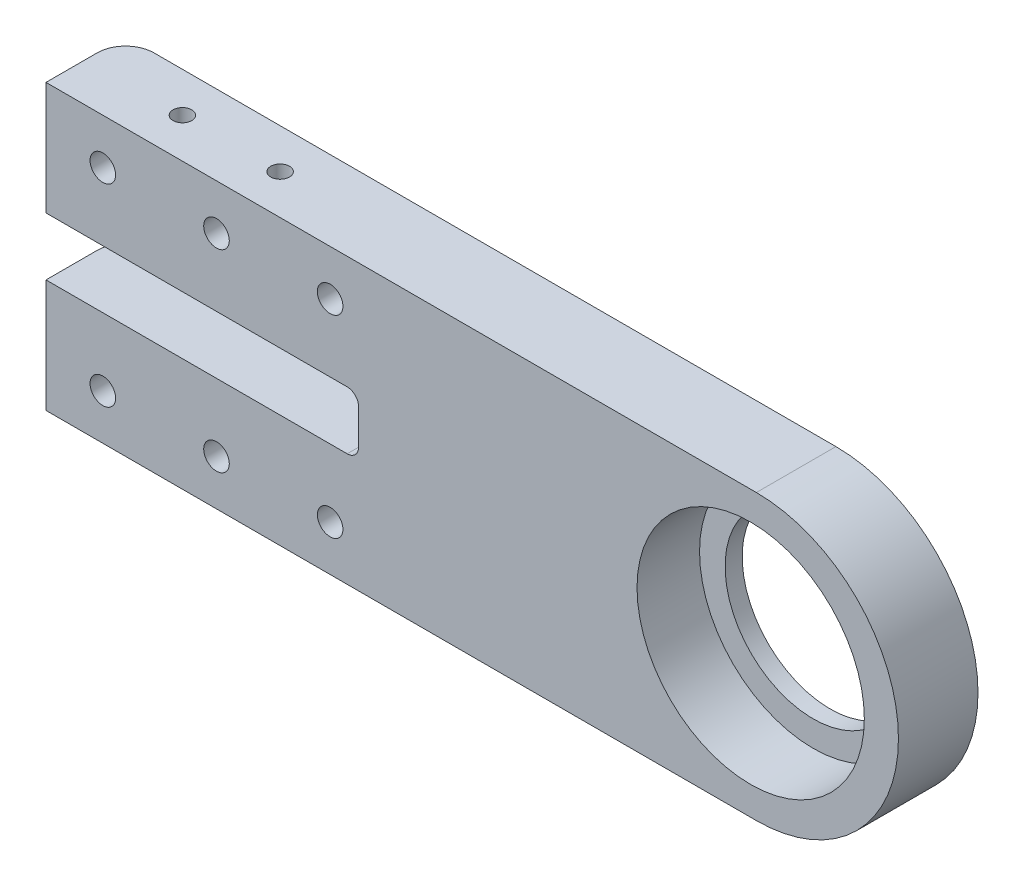
ISO-10303-21;
HEADER;
FILE_DESCRIPTION(('STEP AP214'),'2;1');
FILE_NAME('part.step','',(''),(''),'','','');
FILE_SCHEMA(('AUTOMOTIVE_DESIGN { 1 0 10303 214 1 1 1 1 }'));
ENDSEC;
DATA;
#1=APPLICATION_CONTEXT('core data for automotive mechanical design processes');
#2=APPLICATION_PROTOCOL_DEFINITION('international standard','automotive_design',2000,#1);
#3=PRODUCT_CONTEXT('',#1,'mechanical');
#4=PRODUCT('Part','Part','',(#3));
#5=PRODUCT_RELATED_PRODUCT_CATEGORY('part','',(#4));
#6=PRODUCT_DEFINITION_FORMATION('','',#4);
#7=PRODUCT_DEFINITION_CONTEXT('part definition',#1,'design');
#8=PRODUCT_DEFINITION('design','',#6,#7);
#9=PRODUCT_DEFINITION_SHAPE('','',#8);
#10=(LENGTH_UNIT() NAMED_UNIT(*) SI_UNIT(.MILLI.,.METRE.));
#11=(NAMED_UNIT(*) PLANE_ANGLE_UNIT() SI_UNIT($,.RADIAN.));
#12=(NAMED_UNIT(*) SI_UNIT($,.STERADIAN.) SOLID_ANGLE_UNIT());
#13=UNCERTAINTY_MEASURE_WITH_UNIT(LENGTH_MEASURE(1.E-05),#10,'distance_accuracy_value','');
#14=(GEOMETRIC_REPRESENTATION_CONTEXT(3) GLOBAL_UNCERTAINTY_ASSIGNED_CONTEXT((#13)) GLOBAL_UNIT_ASSIGNED_CONTEXT((#10,
#11,#12)) REPRESENTATION_CONTEXT('',''));
#15=CARTESIAN_POINT('',(0.,0.,0.));
#16=DIRECTION('',(0.,0.,1.));
#17=DIRECTION('',(1.,0.,0.));
#18=AXIS2_PLACEMENT_3D('',#15,#16,#17);
#19=CARTESIAN_POINT('',(0.,-50.,14.));
#20=DIRECTION('',(-1.,0.,0.));
#21=DIRECTION('',(0.,-1.,0.));
#22=AXIS2_PLACEMENT_3D('',#19,#20,#21);
#23=PLANE('',#22);
#24=DIRECTION('',(0.,0.,-1.));
#25=VECTOR('',#24,1.);
#26=CARTESIAN_POINT('',(0.,0.,14.));
#27=LINE('',#26,#25);
#28=CARTESIAN_POINT('',(0.,0.,14.));
#29=VERTEX_POINT('',#28);
#30=CARTESIAN_POINT('',(0.,0.,5.));
#31=VERTEX_POINT('',#30);
#32=EDGE_CURVE('E176',#29,#31,#27,.T.);
#33=ORIENTED_EDGE('',*,*,#32,.T.);
#34=DIRECTION('',(0.,1.,0.));
#35=VECTOR('',#34,1.);
#36=CARTESIAN_POINT('',(0.,-50.,5.));
#37=LINE('',#36,#35);
#38=CARTESIAN_POINT('',(0.,-19.8999999994651,5.));
#39=VERTEX_POINT('',#38);
#40=EDGE_CURVE('E49',#31,#39,#37,.F.);
#41=ORIENTED_EDGE('',*,*,#40,.T.);
#42=DIRECTION('',(0.,0.,1.));
#43=VECTOR('',#42,1.);
#44=CARTESIAN_POINT('',(0.,-19.8999999994651,0.));
#45=LINE('',#44,#43);
#46=CARTESIAN_POINT('',(0.,-19.8999999994651,14.));
#47=VERTEX_POINT('',#46);
#48=EDGE_CURVE('E126',#39,#47,#45,.T.);
#49=ORIENTED_EDGE('',*,*,#48,.T.);
#50=DIRECTION('',(0.,1.,0.));
#51=VECTOR('',#50,1.);
#52=CARTESIAN_POINT('',(0.,-50.,14.));
#53=LINE('',#52,#51);
#54=EDGE_CURVE('E129',#47,#29,#53,.T.);
#55=ORIENTED_EDGE('',*,*,#54,.T.);
#56=EDGE_LOOP('',(#33,#41,#49,#55));
#57=FACE_BOUND('',#56,.T.);
#58=ADVANCED_FACE('F40',(#57),#23,.T.);
#59=DIRECTION('',(0.,0.,1.));
#60=VECTOR('',#59,1.);
#61=CARTESIAN_POINT('',(0.,-30.0999999994651,0.));
#62=LINE('',#61,#60);
#63=CARTESIAN_POINT('',(0.,-30.0999999994651,5.));
#64=VERTEX_POINT('',#63);
#65=CARTESIAN_POINT('',(0.,-30.0999999994651,14.));
#66=VERTEX_POINT('',#65);
#67=EDGE_CURVE('E133',#64,#66,#62,.T.);
#68=ORIENTED_EDGE('',*,*,#67,.F.);
#69=DIRECTION('',(0.,1.,0.));
#70=VECTOR('',#69,1.);
#71=CARTESIAN_POINT('',(0.,-50.,5.));
#72=LINE('',#71,#70);
#73=CARTESIAN_POINT('',(0.,-50.,5.));
#74=VERTEX_POINT('',#73);
#75=EDGE_CURVE('E232',#64,#74,#72,.F.);
#76=ORIENTED_EDGE('',*,*,#75,.T.);
#77=DIRECTION('',(0.,0.,-1.));
#78=VECTOR('',#77,1.);
#79=CARTESIAN_POINT('',(0.,-50.,14.));
#80=LINE('',#79,#78);
#81=CARTESIAN_POINT('',(0.,-50.,14.));
#82=VERTEX_POINT('',#81);
#83=EDGE_CURVE('E183',#82,#74,#80,.T.);
#84=ORIENTED_EDGE('',*,*,#83,.F.);
#85=EDGE_CURVE('E154',#82,#66,#53,.T.);
#86=ORIENTED_EDGE('',*,*,#85,.T.);
#87=EDGE_LOOP('',(#68,#76,#84,#86));
#88=FACE_BOUND('',#87,.T.);
#89=ADVANCED_FACE('F283',(#88),#23,.T.);
#90=CARTESIAN_POINT('',(125.,-50.,14.));
#91=DIRECTION('',(0.,-1.,0.));
#92=DIRECTION('',(0.,0.,-1.));
#93=AXIS2_PLACEMENT_3D('',#90,#91,#92);
#94=PLANE('',#93);
#95=ORIENTED_EDGE('',*,*,#83,.T.);
#96=CARTESIAN_POINT('',(5.00000000000001,-50.,5.));
#97=DIRECTION('',(0.,-1.,0.));
#98=DIRECTION('',(0.,0.,-1.));
#99=AXIS2_PLACEMENT_3D('',#96,#97,#98);
#100=CIRCLE('',#99,5.);
#101=CARTESIAN_POINT('',(5.,-50.,0.));
#102=VERTEX_POINT('',#101);
#103=EDGE_CURVE('E235',#74,#102,#100,.T.);
#104=ORIENTED_EDGE('',*,*,#103,.T.);
#105=DIRECTION('',(-1.,0.,0.));
#106=VECTOR('',#105,1.);
#107=CARTESIAN_POINT('',(125.,-50.,0.));
#108=LINE('',#107,#106);
#109=CARTESIAN_POINT('',(125.,-50.,0.));
#110=VERTEX_POINT('',#109);
#111=EDGE_CURVE('E155',#110,#102,#108,.T.);
#112=ORIENTED_EDGE('',*,*,#111,.F.);
#113=DIRECTION('',(0.,0.,-1.));
#114=VECTOR('',#113,1.);
#115=CARTESIAN_POINT('',(125.,-50.,14.));
#116=LINE('',#115,#114);
#117=CARTESIAN_POINT('',(125.,-50.,14.));
#118=VERTEX_POINT('',#117);
#119=EDGE_CURVE('E187',#118,#110,#116,.T.);
#120=ORIENTED_EDGE('',*,*,#119,.F.);
#121=DIRECTION('',(-1.,0.,0.));
#122=VECTOR('',#121,1.);
#123=CARTESIAN_POINT('',(125.,-50.,14.));
#124=LINE('',#123,#122);
#125=EDGE_CURVE('E172',#118,#82,#124,.T.);
#126=ORIENTED_EDGE('',*,*,#125,.T.);
#127=EDGE_LOOP('',(#95,#104,#112,#120,#126));
#128=FACE_BOUND('',#127,.T.);
#129=ADVANCED_FACE('F267',(#128),#94,.T.);
#130=CARTESIAN_POINT('',(125.,-25.,14.));
#131=DIRECTION('',(0.,0.,-1.));
#132=DIRECTION('',(-1.,0.,0.));
#133=AXIS2_PLACEMENT_3D('',#130,#131,#132);
#134=CYLINDRICAL_SURFACE('',#133,25.);
#135=CARTESIAN_POINT('',(125.,-25.,0.));
#136=DIRECTION('',(0.,0.,-1.));
#137=DIRECTION('',(-1.,0.,0.));
#138=AXIS2_PLACEMENT_3D('',#135,#136,#137);
#139=CIRCLE('',#138,25.);
#140=CARTESIAN_POINT('',(125.,0.,0.));
#141=VERTEX_POINT('',#140);
#142=EDGE_CURVE('E162',#141,#110,#139,.T.);
#143=ORIENTED_EDGE('',*,*,#142,.F.);
#144=DIRECTION('',(0.,0.,-1.));
#145=VECTOR('',#144,1.);
#146=CARTESIAN_POINT('',(125.,0.,14.));
#147=LINE('',#146,#145);
#148=CARTESIAN_POINT('',(125.,0.,14.));
#149=VERTEX_POINT('',#148);
#150=EDGE_CURVE('E190',#149,#141,#147,.T.);
#151=ORIENTED_EDGE('',*,*,#150,.F.);
#152=CARTESIAN_POINT('',(125.,-25.,14.));
#153=DIRECTION('',(0.,0.,-1.));
#154=DIRECTION('',(-1.,0.,0.));
#155=AXIS2_PLACEMENT_3D('',#152,#153,#154);
#156=CIRCLE('',#155,25.);
#157=EDGE_CURVE('E168',#149,#118,#156,.T.);
#158=ORIENTED_EDGE('',*,*,#157,.T.);
#159=ORIENTED_EDGE('',*,*,#119,.T.);
#160=EDGE_LOOP('',(#143,#151,#158,#159));
#161=FACE_BOUND('',#160,.T.);
#162=ADVANCED_FACE('F483',(#161),#134,.T.);
#163=CARTESIAN_POINT('',(0.,0.,14.));
#164=DIRECTION('',(0.,1.,0.));
#165=DIRECTION('',(-1.,0.,0.));
#166=AXIS2_PLACEMENT_3D('',#163,#164,#165);
#167=PLANE('',#166);
#168=CARTESIAN_POINT('',(17.,0.,7.00000000000001));
#169=DIRECTION('',(0.,1.,0.));
#170=DIRECTION('',(0.,0.,1.));
#171=AXIS2_PLACEMENT_3D('',#168,#169,#170);
#172=CIRCLE('',#171,1.65);
#173=CARTESIAN_POINT('',(17.,0.,8.65000000000001));
#174=VERTEX_POINT('',#173);
#175=EDGE_CURVE('E386',#174,#174,#172,.T.);
#176=ORIENTED_EDGE('',*,*,#175,.F.);
#177=EDGE_LOOP('',(#176));
#178=FACE_BOUND('',#177,.T.);
#179=CARTESIAN_POINT('',(34.2,0.,7.00000000000001));
#180=DIRECTION('',(0.,1.,0.));
#181=DIRECTION('',(0.,0.,1.));
#182=AXIS2_PLACEMENT_3D('',#179,#180,#181);
#183=CIRCLE('',#182,1.65);
#184=CARTESIAN_POINT('',(34.2,0.,8.65000000000001));
#185=VERTEX_POINT('',#184);
#186=EDGE_CURVE('E378',#185,#185,#183,.T.);
#187=ORIENTED_EDGE('',*,*,#186,.F.);
#188=EDGE_LOOP('',(#187));
#189=FACE_BOUND('',#188,.T.);
#190=DIRECTION('',(1.,0.,0.));
#191=VECTOR('',#190,1.);
#192=CARTESIAN_POINT('',(0.,0.,0.));
#193=LINE('',#192,#191);
#194=CARTESIAN_POINT('',(5.,0.,0.));
#195=VERTEX_POINT('',#194);
#196=EDGE_CURVE('E177',#195,#141,#193,.T.);
#197=ORIENTED_EDGE('',*,*,#196,.F.);
#198=CARTESIAN_POINT('',(5.,0.,5.));
#199=DIRECTION('',(0.,1.,0.));
#200=DIRECTION('',(-1.,0.,0.));
#201=AXIS2_PLACEMENT_3D('',#198,#199,#200);
#202=CIRCLE('',#201,5.);
#203=EDGE_CURVE('E63',#195,#31,#202,.T.);
#204=ORIENTED_EDGE('',*,*,#203,.T.);
#205=ORIENTED_EDGE('',*,*,#32,.F.);
#206=DIRECTION('',(1.,0.,0.));
#207=VECTOR('',#206,1.);
#208=CARTESIAN_POINT('',(0.,0.,14.));
#209=LINE('',#208,#207);
#210=EDGE_CURVE('E152',#29,#149,#209,.T.);
#211=ORIENTED_EDGE('',*,*,#210,.T.);
#212=ORIENTED_EDGE('',*,*,#150,.T.);
#213=EDGE_LOOP('',(#197,#204,#205,#211,#212));
#214=FACE_BOUND('',#213,.T.);
#215=ADVANCED_FACE('F412',(#178,#189,#214),#167,.T.);
#216=CARTESIAN_POINT('',(125.,-25.,14.));
#217=DIRECTION('',(0.,0.,-1.));
#218=DIRECTION('',(-1.,0.,0.));
#219=AXIS2_PLACEMENT_3D('',#216,#217,#218);
#220=PLANE('',#219);
#221=CARTESIAN_POINT('',(123.999999994871,-24.9999999994651,14.));
#222=DIRECTION('',(0.,0.,1.));
#223=DIRECTION('',(1.,0.,0.));
#224=AXIS2_PLACEMENT_3D('',#221,#222,#223);
#225=CIRCLE('',#224,20.0000000051291);
#226=CARTESIAN_POINT('',(144.,-24.9999999994651,14.));
#227=VERTEX_POINT('',#226);
#228=EDGE_CURVE('E402',#227,#227,#225,.T.);
#229=ORIENTED_EDGE('',*,*,#228,.F.);
#230=EDGE_LOOP('',(#229));
#231=FACE_BOUND('',#230,.T.);
#232=CARTESIAN_POINT('',(10.,-8.,14.));
#233=DIRECTION('',(0.,0.,-1.));
#234=DIRECTION('',(-1.,0.,0.));
#235=AXIS2_PLACEMENT_3D('',#232,#233,#234);
#236=CIRCLE('',#235,2.25);
#237=CARTESIAN_POINT('',(7.75,-8.,14.));
#238=VERTEX_POINT('',#237);
#239=EDGE_CURVE('E362',#238,#238,#236,.T.);
#240=ORIENTED_EDGE('',*,*,#239,.T.);
#241=EDGE_LOOP('',(#240));
#242=FACE_BOUND('',#241,.T.);
#243=CARTESIAN_POINT('',(9.99999999999998,-42.,14.));
#244=DIRECTION('',(0.,0.,-1.));
#245=DIRECTION('',(-1.,0.,0.));
#246=AXIS2_PLACEMENT_3D('',#243,#244,#245);
#247=CIRCLE('',#246,2.25);
#248=CARTESIAN_POINT('',(7.74999999999999,-42.,14.));
#249=VERTEX_POINT('',#248);
#250=EDGE_CURVE('E350',#249,#249,#247,.T.);
#251=ORIENTED_EDGE('',*,*,#250,.T.);
#252=EDGE_LOOP('',(#251));
#253=FACE_BOUND('',#252,.T.);
#254=CARTESIAN_POINT('',(30.,-42.,14.));
#255=DIRECTION('',(0.,0.,-1.));
#256=DIRECTION('',(-1.,0.,0.));
#257=AXIS2_PLACEMENT_3D('',#254,#255,#256);
#258=CIRCLE('',#257,2.25);
#259=CARTESIAN_POINT('',(27.75,-42.,14.));
#260=VERTEX_POINT('',#259);
#261=EDGE_CURVE('E338',#260,#260,#258,.T.);
#262=ORIENTED_EDGE('',*,*,#261,.T.);
#263=EDGE_LOOP('',(#262));
#264=FACE_BOUND('',#263,.T.);
#265=CARTESIAN_POINT('',(30.,-8.,14.));
#266=DIRECTION('',(0.,0.,-1.));
#267=DIRECTION('',(-1.,0.,0.));
#268=AXIS2_PLACEMENT_3D('',#265,#266,#267);
#269=CIRCLE('',#268,2.25);
#270=CARTESIAN_POINT('',(27.75,-8.,14.));
#271=VERTEX_POINT('',#270);
#272=EDGE_CURVE('E326',#271,#271,#269,.T.);
#273=ORIENTED_EDGE('',*,*,#272,.T.);
#274=EDGE_LOOP('',(#273));
#275=FACE_BOUND('',#274,.T.);
#276=CARTESIAN_POINT('',(50.,-8.00000000000001,14.));
#277=DIRECTION('',(0.,0.,-1.));
#278=DIRECTION('',(-1.,0.,0.));
#279=AXIS2_PLACEMENT_3D('',#276,#277,#278);
#280=CIRCLE('',#279,2.25);
#281=CARTESIAN_POINT('',(47.75,-8.00000000000001,14.));
#282=VERTEX_POINT('',#281);
#283=EDGE_CURVE('E314',#282,#282,#280,.T.);
#284=ORIENTED_EDGE('',*,*,#283,.T.);
#285=EDGE_LOOP('',(#284));
#286=FACE_BOUND('',#285,.T.);
#287=CARTESIAN_POINT('',(50.,-42.,14.));
#288=DIRECTION('',(0.,0.,-1.));
#289=DIRECTION('',(-1.,0.,0.));
#290=AXIS2_PLACEMENT_3D('',#287,#288,#289);
#291=CIRCLE('',#290,2.25);
#292=CARTESIAN_POINT('',(47.75,-42.,14.));
#293=VERTEX_POINT('',#292);
#294=EDGE_CURVE('E146',#293,#293,#291,.T.);
#295=ORIENTED_EDGE('',*,*,#294,.T.);
#296=EDGE_LOOP('',(#295));
#297=FACE_BOUND('',#296,.T.);
#298=ORIENTED_EDGE('',*,*,#54,.F.);
#299=DIRECTION('',(-1.,0.,0.));
#300=VECTOR('',#299,1.);
#301=CARTESIAN_POINT('',(55.,-19.8999999994651,14.));
#302=LINE('',#301,#300);
#303=CARTESIAN_POINT('',(53.,-19.8999999994651,14.));
#304=VERTEX_POINT('',#303);
#305=EDGE_CURVE('E138',#304,#47,#302,.T.);
#306=ORIENTED_EDGE('',*,*,#305,.F.);
#307=CARTESIAN_POINT('',(53.,-21.8999999994651,14.));
#308=DIRECTION('',(0.,0.,-1.));
#309=DIRECTION('',(-1.,0.,0.));
#310=AXIS2_PLACEMENT_3D('',#307,#308,#309);
#311=CIRCLE('',#310,2.);
#312=CARTESIAN_POINT('',(55.,-21.8999999994651,14.));
#313=VERTEX_POINT('',#312);
#314=EDGE_CURVE('E209',#304,#313,#311,.T.);
#315=ORIENTED_EDGE('',*,*,#314,.T.);
#316=DIRECTION('',(0.,1.,0.));
#317=VECTOR('',#316,1.);
#318=CARTESIAN_POINT('',(55.,-30.0999999994651,14.));
#319=LINE('',#318,#317);
#320=CARTESIAN_POINT('',(55.,-28.0999999994651,14.));
#321=VERTEX_POINT('',#320);
#322=EDGE_CURVE('E288',#321,#313,#319,.T.);
#323=ORIENTED_EDGE('',*,*,#322,.F.);
#324=CARTESIAN_POINT('',(53.,-28.0999999994651,14.));
#325=DIRECTION('',(0.,0.,-1.));
#326=DIRECTION('',(-1.,0.,0.));
#327=AXIS2_PLACEMENT_3D('',#324,#325,#326);
#328=CIRCLE('',#327,2.);
#329=CARTESIAN_POINT('',(53.,-30.0999999994651,14.));
#330=VERTEX_POINT('',#329);
#331=EDGE_CURVE('E215',#321,#330,#328,.T.);
#332=ORIENTED_EDGE('',*,*,#331,.T.);
#333=DIRECTION('',(1.,0.,0.));
#334=VECTOR('',#333,1.);
#335=CARTESIAN_POINT('',(0.,-30.0999999994651,14.));
#336=LINE('',#335,#334);
#337=EDGE_CURVE('E145',#66,#330,#336,.T.);
#338=ORIENTED_EDGE('',*,*,#337,.F.);
#339=ORIENTED_EDGE('',*,*,#85,.F.);
#340=ORIENTED_EDGE('',*,*,#125,.F.);
#341=ORIENTED_EDGE('',*,*,#157,.F.);
#342=ORIENTED_EDGE('',*,*,#210,.F.);
#343=EDGE_LOOP('',(#298,#306,#315,#323,#332,#338,#339,#340,#341,#342));
#344=FACE_BOUND('',#343,.T.);
#345=ADVANCED_FACE('F149',(#231,#242,#253,#264,#275,#286,#297,#344),#220,.F.);
#346=CARTESIAN_POINT('',(125.,-25.,0.));
#347=DIRECTION('',(0.,0.,-1.));
#348=DIRECTION('',(-1.,0.,0.));
#349=AXIS2_PLACEMENT_3D('',#346,#347,#348);
#350=PLANE('',#349);
#351=CARTESIAN_POINT('',(123.999999994871,-24.9999999994651,0.));
#352=DIRECTION('',(0.,0.,1.));
#353=DIRECTION('',(1.,0.,0.));
#354=AXIS2_PLACEMENT_3D('',#351,#352,#353);
#355=CIRCLE('',#354,15.500000004746);
#356=CARTESIAN_POINT('',(139.499999999617,-24.9999999994651,0.));
#357=VERTEX_POINT('',#356);
#358=EDGE_CURVE('E390',#357,#357,#355,.T.);
#359=ORIENTED_EDGE('',*,*,#358,.T.);
#360=EDGE_LOOP('',(#359));
#361=FACE_BOUND('',#360,.T.);
#362=CARTESIAN_POINT('',(10.,-8.,0.));
#363=DIRECTION('',(0.,0.,-1.));
#364=DIRECTION('',(-1.,0.,0.));
#365=AXIS2_PLACEMENT_3D('',#362,#363,#364);
#366=CIRCLE('',#365,4.7);
#367=CARTESIAN_POINT('',(5.3,-8.,0.));
#368=VERTEX_POINT('',#367);
#369=EDGE_CURVE('E370',#368,#368,#366,.T.);
#370=ORIENTED_EDGE('',*,*,#369,.F.);
#371=EDGE_LOOP('',(#370));
#372=FACE_BOUND('',#371,.T.);
#373=CARTESIAN_POINT('',(9.99999999999998,-42.,0.));
#374=DIRECTION('',(0.,0.,-1.));
#375=DIRECTION('',(-1.,0.,0.));
#376=AXIS2_PLACEMENT_3D('',#373,#374,#375);
#377=CIRCLE('',#376,4.7);
#378=CARTESIAN_POINT('',(5.29999999999999,-42.,0.));
#379=VERTEX_POINT('',#378);
#380=EDGE_CURVE('E358',#379,#379,#377,.T.);
#381=ORIENTED_EDGE('',*,*,#380,.F.);
#382=EDGE_LOOP('',(#381));
#383=FACE_BOUND('',#382,.T.);
#384=CARTESIAN_POINT('',(30.,-42.,0.));
#385=DIRECTION('',(0.,0.,-1.));
#386=DIRECTION('',(-1.,0.,0.));
#387=AXIS2_PLACEMENT_3D('',#384,#385,#386);
#388=CIRCLE('',#387,4.7);
#389=CARTESIAN_POINT('',(25.3,-42.,0.));
#390=VERTEX_POINT('',#389);
#391=EDGE_CURVE('E346',#390,#390,#388,.T.);
#392=ORIENTED_EDGE('',*,*,#391,.F.);
#393=EDGE_LOOP('',(#392));
#394=FACE_BOUND('',#393,.T.);
#395=CARTESIAN_POINT('',(30.,-8.,0.));
#396=DIRECTION('',(0.,0.,-1.));
#397=DIRECTION('',(-1.,0.,0.));
#398=AXIS2_PLACEMENT_3D('',#395,#396,#397);
#399=CIRCLE('',#398,4.7);
#400=CARTESIAN_POINT('',(25.3,-8.,0.));
#401=VERTEX_POINT('',#400);
#402=EDGE_CURVE('E334',#401,#401,#399,.T.);
#403=ORIENTED_EDGE('',*,*,#402,.F.);
#404=EDGE_LOOP('',(#403));
#405=FACE_BOUND('',#404,.T.);
#406=CARTESIAN_POINT('',(50.,-8.00000000000001,0.));
#407=DIRECTION('',(0.,0.,-1.));
#408=DIRECTION('',(-1.,0.,0.));
#409=AXIS2_PLACEMENT_3D('',#406,#407,#408);
#410=CIRCLE('',#409,4.7);
#411=CARTESIAN_POINT('',(45.3,-8.00000000000001,0.));
#412=VERTEX_POINT('',#411);
#413=EDGE_CURVE('E322',#412,#412,#410,.T.);
#414=ORIENTED_EDGE('',*,*,#413,.F.);
#415=EDGE_LOOP('',(#414));
#416=FACE_BOUND('',#415,.T.);
#417=CARTESIAN_POINT('',(50.,-42.,0.));
#418=DIRECTION('',(0.,0.,-1.));
#419=DIRECTION('',(-1.,0.,0.));
#420=AXIS2_PLACEMENT_3D('',#417,#418,#419);
#421=CIRCLE('',#420,4.7);
#422=CARTESIAN_POINT('',(45.3,-42.,0.));
#423=VERTEX_POINT('',#422);
#424=EDGE_CURVE('E310',#423,#423,#421,.T.);
#425=ORIENTED_EDGE('',*,*,#424,.F.);
#426=EDGE_LOOP('',(#425));
#427=FACE_BOUND('',#426,.T.);
#428=ORIENTED_EDGE('',*,*,#111,.T.);
#429=DIRECTION('',(0.,1.,0.));
#430=VECTOR('',#429,1.);
#431=CARTESIAN_POINT('',(5.,-25.,0.));
#432=LINE('',#431,#430);
#433=CARTESIAN_POINT('',(5.,-30.0999999994651,0.));
#434=VERTEX_POINT('',#433);
#435=EDGE_CURVE('E225',#102,#434,#432,.T.);
#436=ORIENTED_EDGE('',*,*,#435,.T.);
#437=DIRECTION('',(1.,0.,0.));
#438=VECTOR('',#437,1.);
#439=CARTESIAN_POINT('',(0.,-30.0999999994651,0.));
#440=LINE('',#439,#438);
#441=CARTESIAN_POINT('',(53.,-30.0999999994651,0.));
#442=VERTEX_POINT('',#441);
#443=EDGE_CURVE('E281',#434,#442,#440,.T.);
#444=ORIENTED_EDGE('',*,*,#443,.T.);
#445=CARTESIAN_POINT('',(53.,-28.0999999994651,0.));
#446=DIRECTION('',(0.,0.,-1.));
#447=DIRECTION('',(-1.,0.,0.));
#448=AXIS2_PLACEMENT_3D('',#445,#446,#447);
#449=CIRCLE('',#448,2.);
#450=CARTESIAN_POINT('',(55.,-28.0999999994651,0.));
#451=VERTEX_POINT('',#450);
#452=EDGE_CURVE('E218',#442,#451,#449,.F.);
#453=ORIENTED_EDGE('',*,*,#452,.T.);
#454=DIRECTION('',(0.,1.,0.));
#455=VECTOR('',#454,1.);
#456=CARTESIAN_POINT('',(55.,-30.0999999994651,0.));
#457=LINE('',#456,#455);
#458=CARTESIAN_POINT('',(55.,-21.8999999994651,0.));
#459=VERTEX_POINT('',#458);
#460=EDGE_CURVE('E134',#451,#459,#457,.T.);
#461=ORIENTED_EDGE('',*,*,#460,.T.);
#462=CARTESIAN_POINT('',(53.,-21.8999999994651,0.));
#463=DIRECTION('',(0.,0.,-1.));
#464=DIRECTION('',(-1.,0.,0.));
#465=AXIS2_PLACEMENT_3D('',#462,#463,#464);
#466=CIRCLE('',#465,2.);
#467=CARTESIAN_POINT('',(53.,-19.8999999994651,0.));
#468=VERTEX_POINT('',#467);
#469=EDGE_CURVE('E212',#459,#468,#466,.F.);
#470=ORIENTED_EDGE('',*,*,#469,.T.);
#471=DIRECTION('',(-1.,0.,0.));
#472=VECTOR('',#471,1.);
#473=CARTESIAN_POINT('',(55.,-19.8999999994651,0.));
#474=LINE('',#473,#472);
#475=CARTESIAN_POINT('',(5.,-19.8999999994651,0.));
#476=VERTEX_POINT('',#475);
#477=EDGE_CURVE('E292',#468,#476,#474,.T.);
#478=ORIENTED_EDGE('',*,*,#477,.T.);
#479=DIRECTION('',(0.,1.,0.));
#480=VECTOR('',#479,1.);
#481=CARTESIAN_POINT('',(5.,-25.,0.));
#482=LINE('',#481,#480);
#483=EDGE_CURVE('E221',#476,#195,#482,.T.);
#484=ORIENTED_EDGE('',*,*,#483,.T.);
#485=ORIENTED_EDGE('',*,*,#196,.T.);
#486=ORIENTED_EDGE('',*,*,#142,.T.);
#487=EDGE_LOOP('',(#428,#436,#444,#453,#461,#470,#478,#484,#485,#486));
#488=FACE_BOUND('',#487,.T.);
#489=ADVANCED_FACE('F272',(#361,#372,#383,#394,#405,#416,#427,#488),#350,.T.);
#490=CARTESIAN_POINT('',(55.,-19.8999999994651,0.));
#491=DIRECTION('',(0.,1.,0.));
#492=DIRECTION('',(-1.,0.,0.));
#493=AXIS2_PLACEMENT_3D('',#490,#491,#492);
#494=PLANE('',#493);
#495=CARTESIAN_POINT('',(17.,-19.8999999994651,7.00000000000001));
#496=DIRECTION('',(0.,1.,0.));
#497=DIRECTION('',(-1.,0.,0.));
#498=AXIS2_PLACEMENT_3D('',#495,#496,#497);
#499=CIRCLE('',#498,1.65);
#500=CARTESIAN_POINT('',(15.35,-19.8999999994651,7.00000000000001));
#501=VERTEX_POINT('',#500);
#502=EDGE_CURVE('E382',#501,#501,#499,.T.);
#503=ORIENTED_EDGE('',*,*,#502,.T.);
#504=EDGE_LOOP('',(#503));
#505=FACE_BOUND('',#504,.T.);
#506=CARTESIAN_POINT('',(34.2,-19.8999999994651,7.00000000000001));
#507=DIRECTION('',(0.,1.,0.));
#508=DIRECTION('',(-1.,0.,0.));
#509=AXIS2_PLACEMENT_3D('',#506,#507,#508);
#510=CIRCLE('',#509,1.65);
#511=CARTESIAN_POINT('',(32.55,-19.8999999994651,7.00000000000001));
#512=VERTEX_POINT('',#511);
#513=EDGE_CURVE('E374',#512,#512,#510,.T.);
#514=ORIENTED_EDGE('',*,*,#513,.T.);
#515=EDGE_LOOP('',(#514));
#516=FACE_BOUND('',#515,.T.);
#517=ORIENTED_EDGE('',*,*,#48,.F.);
#518=CARTESIAN_POINT('',(5.,-19.8999999994651,5.));
#519=DIRECTION('',(0.,1.,0.));
#520=DIRECTION('',(-1.,0.,0.));
#521=AXIS2_PLACEMENT_3D('',#518,#519,#520);
#522=CIRCLE('',#521,5.);
#523=EDGE_CURVE('E11',#39,#476,#522,.F.);
#524=ORIENTED_EDGE('',*,*,#523,.T.);
#525=ORIENTED_EDGE('',*,*,#477,.F.);
#526=DIRECTION('',(0.,0.,1.));
#527=VECTOR('',#526,1.);
#528=CARTESIAN_POINT('',(53.,-19.8999999994651,14.));
#529=LINE('',#528,#527);
#530=EDGE_CURVE('E142',#468,#304,#529,.T.);
#531=ORIENTED_EDGE('',*,*,#530,.T.);
#532=ORIENTED_EDGE('',*,*,#305,.T.);
#533=EDGE_LOOP('',(#517,#524,#525,#531,#532));
#534=FACE_BOUND('',#533,.T.);
#535=ADVANCED_FACE('F139',(#505,#516,#534),#494,.F.);
#536=CARTESIAN_POINT('',(55.,-30.0999999994651,0.));
#537=DIRECTION('',(1.,0.,0.));
#538=DIRECTION('',(0.,0.,-1.));
#539=AXIS2_PLACEMENT_3D('',#536,#537,#538);
#540=PLANE('',#539);
#541=ORIENTED_EDGE('',*,*,#322,.T.);
#542=DIRECTION('',(0.,0.,1.));
#543=VECTOR('',#542,1.);
#544=CARTESIAN_POINT('',(55.,-21.8999999994651,0.));
#545=LINE('',#544,#543);
#546=EDGE_CURVE('E202',#313,#459,#545,.F.);
#547=ORIENTED_EDGE('',*,*,#546,.T.);
#548=ORIENTED_EDGE('',*,*,#460,.F.);
#549=DIRECTION('',(0.,0.,1.));
#550=VECTOR('',#549,1.);
#551=CARTESIAN_POINT('',(55.,-28.0999999994651,14.));
#552=LINE('',#551,#550);
#553=EDGE_CURVE('E198',#451,#321,#552,.T.);
#554=ORIENTED_EDGE('',*,*,#553,.T.);
#555=EDGE_LOOP('',(#541,#547,#548,#554));
#556=FACE_BOUND('',#555,.T.);
#557=ADVANCED_FACE('F445',(#556),#540,.F.);
#558=CARTESIAN_POINT('',(0.,-30.0999999994651,0.));
#559=DIRECTION('',(0.,-1.,0.));
#560=DIRECTION('',(1.,0.,0.));
#561=AXIS2_PLACEMENT_3D('',#558,#559,#560);
#562=PLANE('',#561);
#563=ORIENTED_EDGE('',*,*,#443,.F.);
#564=CARTESIAN_POINT('',(5.,-30.0999999994651,5.));
#565=DIRECTION('',(0.,-1.,0.));
#566=DIRECTION('',(1.,0.,0.));
#567=AXIS2_PLACEMENT_3D('',#564,#565,#566);
#568=CIRCLE('',#567,5.);
#569=EDGE_CURVE('E229',#434,#64,#568,.F.);
#570=ORIENTED_EDGE('',*,*,#569,.T.);
#571=ORIENTED_EDGE('',*,*,#67,.T.);
#572=ORIENTED_EDGE('',*,*,#337,.T.);
#573=DIRECTION('',(0.,0.,1.));
#574=VECTOR('',#573,1.);
#575=CARTESIAN_POINT('',(53.,-30.0999999994651,0.));
#576=LINE('',#575,#574);
#577=EDGE_CURVE('E205',#330,#442,#576,.F.);
#578=ORIENTED_EDGE('',*,*,#577,.T.);
#579=EDGE_LOOP('',(#563,#570,#571,#572,#578));
#580=FACE_BOUND('',#579,.T.);
#581=ADVANCED_FACE('F278',(#580),#562,.F.);
#582=CARTESIAN_POINT('',(50.,-42.,0.));
#583=DIRECTION('',(0.,0.,-1.));
#584=DIRECTION('',(-1.,0.,0.));
#585=AXIS2_PLACEMENT_3D('',#582,#583,#584);
#586=CYLINDRICAL_SURFACE('',#585,2.25);
#587=ORIENTED_EDGE('',*,*,#294,.F.);
#588=EDGE_LOOP('',(#587));
#589=FACE_BOUND('',#588,.T.);
#590=CARTESIAN_POINT('',(50.,-42.,2.45));
#591=DIRECTION('',(0.,0.,-1.));
#592=DIRECTION('',(-1.,0.,0.));
#593=AXIS2_PLACEMENT_3D('',#590,#591,#592);
#594=CIRCLE('',#593,2.25);
#595=CARTESIAN_POINT('',(47.75,-42.,2.45));
#596=VERTEX_POINT('',#595);
#597=EDGE_CURVE('E306',#596,#596,#594,.T.);
#598=ORIENTED_EDGE('',*,*,#597,.T.);
#599=EDGE_LOOP('',(#598));
#600=FACE_BOUND('',#599,.T.);
#601=ADVANCED_FACE('F426',(#589,#600),#586,.F.);
#602=CARTESIAN_POINT('',(50.,-42.,0.));
#603=DIRECTION('',(0.,0.,-1.));
#604=DIRECTION('',(-1.,0.,0.));
#605=AXIS2_PLACEMENT_3D('',#602,#603,#604);
#606=CONICAL_SURFACE('',#605,4.7,0.785398163397449);
#607=ORIENTED_EDGE('',*,*,#597,.F.);
#608=EDGE_LOOP('',(#607));
#609=FACE_BOUND('',#608,.T.);
#610=ORIENTED_EDGE('',*,*,#424,.T.);
#611=EDGE_LOOP('',(#610));
#612=FACE_BOUND('',#611,.T.);
#613=ADVANCED_FACE('F429',(#609,#612),#606,.F.);
#614=CARTESIAN_POINT('',(50.,-8.00000000000001,0.));
#615=DIRECTION('',(0.,0.,-1.));
#616=DIRECTION('',(-1.,0.,0.));
#617=AXIS2_PLACEMENT_3D('',#614,#615,#616);
#618=CYLINDRICAL_SURFACE('',#617,2.25);
#619=ORIENTED_EDGE('',*,*,#283,.F.);
#620=EDGE_LOOP('',(#619));
#621=FACE_BOUND('',#620,.T.);
#622=CARTESIAN_POINT('',(50.,-8.00000000000001,2.45));
#623=DIRECTION('',(0.,0.,-1.));
#624=DIRECTION('',(-1.,0.,0.));
#625=AXIS2_PLACEMENT_3D('',#622,#623,#624);
#626=CIRCLE('',#625,2.25);
#627=CARTESIAN_POINT('',(47.75,-8.00000000000001,2.45));
#628=VERTEX_POINT('',#627);
#629=EDGE_CURVE('E318',#628,#628,#626,.T.);
#630=ORIENTED_EDGE('',*,*,#629,.T.);
#631=EDGE_LOOP('',(#630));
#632=FACE_BOUND('',#631,.T.);
#633=ADVANCED_FACE('F435',(#621,#632),#618,.F.);
#634=CARTESIAN_POINT('',(50.,-8.00000000000001,0.));
#635=DIRECTION('',(0.,0.,-1.));
#636=DIRECTION('',(-1.,0.,0.));
#637=AXIS2_PLACEMENT_3D('',#634,#635,#636);
#638=CONICAL_SURFACE('',#637,4.7,0.785398163397449);
#639=ORIENTED_EDGE('',*,*,#629,.F.);
#640=EDGE_LOOP('',(#639));
#641=FACE_BOUND('',#640,.T.);
#642=ORIENTED_EDGE('',*,*,#413,.T.);
#643=EDGE_LOOP('',(#642));
#644=FACE_BOUND('',#643,.T.);
#645=ADVANCED_FACE('F538',(#641,#644),#638,.F.);
#646=CARTESIAN_POINT('',(30.,-8.,0.));
#647=DIRECTION('',(0.,0.,-1.));
#648=DIRECTION('',(-1.,0.,0.));
#649=AXIS2_PLACEMENT_3D('',#646,#647,#648);
#650=CYLINDRICAL_SURFACE('',#649,2.25);
#651=ORIENTED_EDGE('',*,*,#272,.F.);
#652=EDGE_LOOP('',(#651));
#653=FACE_BOUND('',#652,.T.);
#654=CARTESIAN_POINT('',(30.,-8.,2.45));
#655=DIRECTION('',(0.,0.,-1.));
#656=DIRECTION('',(-1.,0.,0.));
#657=AXIS2_PLACEMENT_3D('',#654,#655,#656);
#658=CIRCLE('',#657,2.25);
#659=CARTESIAN_POINT('',(27.75,-8.,2.45));
#660=VERTEX_POINT('',#659);
#661=EDGE_CURVE('E330',#660,#660,#658,.T.);
#662=ORIENTED_EDGE('',*,*,#661,.T.);
#663=EDGE_LOOP('',(#662));
#664=FACE_BOUND('',#663,.T.);
#665=ADVANCED_FACE('F534',(#653,#664),#650,.F.);
#666=CARTESIAN_POINT('',(30.,-8.,0.));
#667=DIRECTION('',(0.,0.,-1.));
#668=DIRECTION('',(-1.,0.,0.));
#669=AXIS2_PLACEMENT_3D('',#666,#667,#668);
#670=CONICAL_SURFACE('',#669,4.7,0.785398163397448);
#671=ORIENTED_EDGE('',*,*,#661,.F.);
#672=EDGE_LOOP('',(#671));
#673=FACE_BOUND('',#672,.T.);
#674=ORIENTED_EDGE('',*,*,#402,.T.);
#675=EDGE_LOOP('',(#674));
#676=FACE_BOUND('',#675,.T.);
#677=ADVANCED_FACE('F530',(#673,#676),#670,.F.);
#678=CARTESIAN_POINT('',(30.,-42.,0.));
#679=DIRECTION('',(0.,0.,-1.));
#680=DIRECTION('',(-1.,0.,0.));
#681=AXIS2_PLACEMENT_3D('',#678,#679,#680);
#682=CYLINDRICAL_SURFACE('',#681,2.25);
#683=ORIENTED_EDGE('',*,*,#261,.F.);
#684=EDGE_LOOP('',(#683));
#685=FACE_BOUND('',#684,.T.);
#686=CARTESIAN_POINT('',(30.,-42.,2.45));
#687=DIRECTION('',(0.,0.,-1.));
#688=DIRECTION('',(-1.,0.,0.));
#689=AXIS2_PLACEMENT_3D('',#686,#687,#688);
#690=CIRCLE('',#689,2.25);
#691=CARTESIAN_POINT('',(27.75,-42.,2.45));
#692=VERTEX_POINT('',#691);
#693=EDGE_CURVE('E342',#692,#692,#690,.T.);
#694=ORIENTED_EDGE('',*,*,#693,.T.);
#695=EDGE_LOOP('',(#694));
#696=FACE_BOUND('',#695,.T.);
#697=ADVANCED_FACE('F526',(#685,#696),#682,.F.);
#698=CARTESIAN_POINT('',(30.,-42.,0.));
#699=DIRECTION('',(0.,0.,-1.));
#700=DIRECTION('',(-1.,0.,0.));
#701=AXIS2_PLACEMENT_3D('',#698,#699,#700);
#702=CONICAL_SURFACE('',#701,4.7,0.785398163397449);
#703=ORIENTED_EDGE('',*,*,#693,.F.);
#704=EDGE_LOOP('',(#703));
#705=FACE_BOUND('',#704,.T.);
#706=ORIENTED_EDGE('',*,*,#391,.T.);
#707=EDGE_LOOP('',(#706));
#708=FACE_BOUND('',#707,.T.);
#709=ADVANCED_FACE('F522',(#705,#708),#702,.F.);
#710=CARTESIAN_POINT('',(9.99999999999998,-42.,0.));
#711=DIRECTION('',(0.,0.,-1.));
#712=DIRECTION('',(-1.,0.,0.));
#713=AXIS2_PLACEMENT_3D('',#710,#711,#712);
#714=CYLINDRICAL_SURFACE('',#713,2.25);
#715=ORIENTED_EDGE('',*,*,#250,.F.);
#716=EDGE_LOOP('',(#715));
#717=FACE_BOUND('',#716,.T.);
#718=CARTESIAN_POINT('',(9.99999999999998,-42.,2.45));
#719=DIRECTION('',(0.,0.,-1.));
#720=DIRECTION('',(-1.,0.,0.));
#721=AXIS2_PLACEMENT_3D('',#718,#719,#720);
#722=CIRCLE('',#721,2.25);
#723=CARTESIAN_POINT('',(7.74999999999999,-42.,2.45));
#724=VERTEX_POINT('',#723);
#725=EDGE_CURVE('E354',#724,#724,#722,.T.);
#726=ORIENTED_EDGE('',*,*,#725,.T.);
#727=EDGE_LOOP('',(#726));
#728=FACE_BOUND('',#727,.T.);
#729=ADVANCED_FACE('F518',(#717,#728),#714,.F.);
#730=CARTESIAN_POINT('',(9.99999999999998,-42.,0.));
#731=DIRECTION('',(0.,0.,-1.));
#732=DIRECTION('',(-1.,0.,0.));
#733=AXIS2_PLACEMENT_3D('',#730,#731,#732);
#734=CONICAL_SURFACE('',#733,4.7,0.785398163397448);
#735=ORIENTED_EDGE('',*,*,#725,.F.);
#736=EDGE_LOOP('',(#735));
#737=FACE_BOUND('',#736,.T.);
#738=ORIENTED_EDGE('',*,*,#380,.T.);
#739=EDGE_LOOP('',(#738));
#740=FACE_BOUND('',#739,.T.);
#741=ADVANCED_FACE('F514',(#737,#740),#734,.F.);
#742=CARTESIAN_POINT('',(10.,-8.,0.));
#743=DIRECTION('',(0.,0.,-1.));
#744=DIRECTION('',(-1.,0.,0.));
#745=AXIS2_PLACEMENT_3D('',#742,#743,#744);
#746=CYLINDRICAL_SURFACE('',#745,2.25);
#747=ORIENTED_EDGE('',*,*,#239,.F.);
#748=EDGE_LOOP('',(#747));
#749=FACE_BOUND('',#748,.T.);
#750=CARTESIAN_POINT('',(10.,-8.,2.45));
#751=DIRECTION('',(0.,0.,-1.));
#752=DIRECTION('',(-1.,0.,0.));
#753=AXIS2_PLACEMENT_3D('',#750,#751,#752);
#754=CIRCLE('',#753,2.25);
#755=CARTESIAN_POINT('',(7.75,-8.,2.45));
#756=VERTEX_POINT('',#755);
#757=EDGE_CURVE('E366',#756,#756,#754,.T.);
#758=ORIENTED_EDGE('',*,*,#757,.T.);
#759=EDGE_LOOP('',(#758));
#760=FACE_BOUND('',#759,.T.);
#761=ADVANCED_FACE('F506',(#749,#760),#746,.F.);
#762=CARTESIAN_POINT('',(10.,-8.,0.));
#763=DIRECTION('',(0.,0.,-1.));
#764=DIRECTION('',(-1.,0.,0.));
#765=AXIS2_PLACEMENT_3D('',#762,#763,#764);
#766=CONICAL_SURFACE('',#765,4.7,0.785398163397448);
#767=ORIENTED_EDGE('',*,*,#757,.F.);
#768=EDGE_LOOP('',(#767));
#769=FACE_BOUND('',#768,.T.);
#770=ORIENTED_EDGE('',*,*,#369,.T.);
#771=EDGE_LOOP('',(#770));
#772=FACE_BOUND('',#771,.T.);
#773=ADVANCED_FACE('F496',(#769,#772),#766,.F.);
#774=CARTESIAN_POINT('',(34.2,0.,7.00000000000001));
#775=DIRECTION('',(0.,1.,0.));
#776=DIRECTION('',(0.,0.,1.));
#777=AXIS2_PLACEMENT_3D('',#774,#775,#776);
#778=CYLINDRICAL_SURFACE('',#777,1.65);
#779=ORIENTED_EDGE('',*,*,#513,.F.);
#780=EDGE_LOOP('',(#779));
#781=FACE_BOUND('',#780,.T.);
#782=ORIENTED_EDGE('',*,*,#186,.T.);
#783=EDGE_LOOP('',(#782));
#784=FACE_BOUND('',#783,.T.);
#785=ADVANCED_FACE('F493',(#781,#784),#778,.F.);
#786=CARTESIAN_POINT('',(17.,0.,7.00000000000001));
#787=DIRECTION('',(0.,1.,0.));
#788=DIRECTION('',(0.,0.,1.));
#789=AXIS2_PLACEMENT_3D('',#786,#787,#788);
#790=CYLINDRICAL_SURFACE('',#789,1.65);
#791=ORIENTED_EDGE('',*,*,#502,.F.);
#792=EDGE_LOOP('',(#791));
#793=FACE_BOUND('',#792,.T.);
#794=ORIENTED_EDGE('',*,*,#175,.T.);
#795=EDGE_LOOP('',(#794));
#796=FACE_BOUND('',#795,.T.);
#797=ADVANCED_FACE('F495',(#793,#796),#790,.F.);
#798=CARTESIAN_POINT('',(123.999999994871,-24.9999999994651,14.));
#799=DIRECTION('',(0.,0.,1.));
#800=DIRECTION('',(1.,0.,0.));
#801=AXIS2_PLACEMENT_3D('',#798,#799,#800);
#802=CYLINDRICAL_SURFACE('',#801,15.500000004746);
#803=ORIENTED_EDGE('',*,*,#358,.F.);
#804=EDGE_LOOP('',(#803));
#805=FACE_BOUND('',#804,.T.);
#806=CARTESIAN_POINT('',(123.999999994871,-24.9999999994651,3.));
#807=DIRECTION('',(0.,0.,1.));
#808=DIRECTION('',(1.,0.,0.));
#809=AXIS2_PLACEMENT_3D('',#806,#807,#808);
#810=CIRCLE('',#809,15.500000004746);
#811=CARTESIAN_POINT('',(139.499999999617,-24.9999999994651,3.));
#812=VERTEX_POINT('',#811);
#813=EDGE_CURVE('E394',#812,#812,#810,.T.);
#814=ORIENTED_EDGE('',*,*,#813,.T.);
#815=EDGE_LOOP('',(#814));
#816=FACE_BOUND('',#815,.T.);
#817=ADVANCED_FACE('F503',(#805,#816),#802,.F.);
#818=CARTESIAN_POINT('',(139.499999999617,-24.9999999994651,3.));
#819=DIRECTION('',(0.,0.,-1.));
#820=DIRECTION('',(-1.,0.,0.));
#821=AXIS2_PLACEMENT_3D('',#818,#819,#820);
#822=PLANE('',#821);
#823=ORIENTED_EDGE('',*,*,#813,.F.);
#824=EDGE_LOOP('',(#823));
#825=FACE_BOUND('',#824,.T.);
#826=CARTESIAN_POINT('',(123.999999994871,-24.9999999994651,3.));
#827=DIRECTION('',(0.,0.,1.));
#828=DIRECTION('',(1.,0.,0.));
#829=AXIS2_PLACEMENT_3D('',#826,#827,#828);
#830=CIRCLE('',#829,20.0000000051291);
#831=CARTESIAN_POINT('',(144.,-24.9999999994651,3.));
#832=VERTEX_POINT('',#831);
#833=EDGE_CURVE('E398',#832,#832,#830,.T.);
#834=ORIENTED_EDGE('',*,*,#833,.T.);
#835=EDGE_LOOP('',(#834));
#836=FACE_BOUND('',#835,.T.);
#837=ADVANCED_FACE('F620',(#825,#836),#822,.F.);
#838=CARTESIAN_POINT('',(123.999999994871,-24.9999999994651,14.));
#839=DIRECTION('',(0.,0.,1.));
#840=DIRECTION('',(1.,0.,0.));
#841=AXIS2_PLACEMENT_3D('',#838,#839,#840);
#842=CYLINDRICAL_SURFACE('',#841,20.0000000051291);
#843=ORIENTED_EDGE('',*,*,#833,.F.);
#844=EDGE_LOOP('',(#843));
#845=FACE_BOUND('',#844,.T.);
#846=ORIENTED_EDGE('',*,*,#228,.T.);
#847=EDGE_LOOP('',(#846));
#848=FACE_BOUND('',#847,.T.);
#849=ADVANCED_FACE('F408',(#845,#848),#842,.F.);
#850=CARTESIAN_POINT('',(53.,-21.8999999994651,0.));
#851=DIRECTION('',(0.,0.,-1.));
#852=DIRECTION('',(-1.,0.,0.));
#853=AXIS2_PLACEMENT_3D('',#850,#851,#852);
#854=CYLINDRICAL_SURFACE('',#853,2.);
#855=ORIENTED_EDGE('',*,*,#469,.F.);
#856=ORIENTED_EDGE('',*,*,#546,.F.);
#857=ORIENTED_EDGE('',*,*,#314,.F.);
#858=ORIENTED_EDGE('',*,*,#530,.F.);
#859=EDGE_LOOP('',(#855,#856,#857,#858));
#860=FACE_BOUND('',#859,.T.);
#861=ADVANCED_FACE('F458',(#860),#854,.F.);
#862=CARTESIAN_POINT('',(53.,-28.0999999994651,0.));
#863=DIRECTION('',(0.,0.,-1.));
#864=DIRECTION('',(-1.,0.,0.));
#865=AXIS2_PLACEMENT_3D('',#862,#863,#864);
#866=CYLINDRICAL_SURFACE('',#865,2.);
#867=ORIENTED_EDGE('',*,*,#452,.F.);
#868=ORIENTED_EDGE('',*,*,#577,.F.);
#869=ORIENTED_EDGE('',*,*,#331,.F.);
#870=ORIENTED_EDGE('',*,*,#553,.F.);
#871=EDGE_LOOP('',(#867,#868,#869,#870));
#872=FACE_BOUND('',#871,.T.);
#873=ADVANCED_FACE('F461',(#872),#866,.F.);
#874=CARTESIAN_POINT('',(5.,-25.,5.));
#875=DIRECTION('',(0.,1.,0.));
#876=DIRECTION('',(-1.,0.,0.));
#877=AXIS2_PLACEMENT_3D('',#874,#875,#876);
#878=CYLINDRICAL_SURFACE('',#877,5.);
#879=ORIENTED_EDGE('',*,*,#103,.F.);
#880=ORIENTED_EDGE('',*,*,#75,.F.);
#881=ORIENTED_EDGE('',*,*,#569,.F.);
#882=ORIENTED_EDGE('',*,*,#435,.F.);
#883=EDGE_LOOP('',(#879,#880,#881,#882));
#884=FACE_BOUND('',#883,.T.);
#885=ADVANCED_FACE('F275',(#884),#878,.T.);
#886=CARTESIAN_POINT('',(5.,-25.,5.));
#887=DIRECTION('',(0.,1.,0.));
#888=DIRECTION('',(-1.,0.,0.));
#889=AXIS2_PLACEMENT_3D('',#886,#887,#888);
#890=CYLINDRICAL_SURFACE('',#889,5.);
#891=ORIENTED_EDGE('',*,*,#523,.F.);
#892=ORIENTED_EDGE('',*,*,#40,.F.);
#893=ORIENTED_EDGE('',*,*,#203,.F.);
#894=ORIENTED_EDGE('',*,*,#483,.F.);
#895=EDGE_LOOP('',(#891,#892,#893,#894));
#896=FACE_BOUND('',#895,.T.);
#897=ADVANCED_FACE('F42',(#896),#890,.T.);
#898=CLOSED_SHELL('',(#58,#89,#129,#162,#215,#345,#489,#535,#557,#581,#601,#613,#633,#645,#665,
#677,#697,#709,#729,#741,#761,#773,#785,#797,#817,#837,#849,#861,#873,#885,#897));
#899=MANIFOLD_SOLID_BREP('B2',#898);
#900=ADVANCED_BREP_SHAPE_REPRESENTATION('',(#18,#899),#14);
#901=SHAPE_DEFINITION_REPRESENTATION(#9,#900);
ENDSEC;
END-ISO-10303-21;
